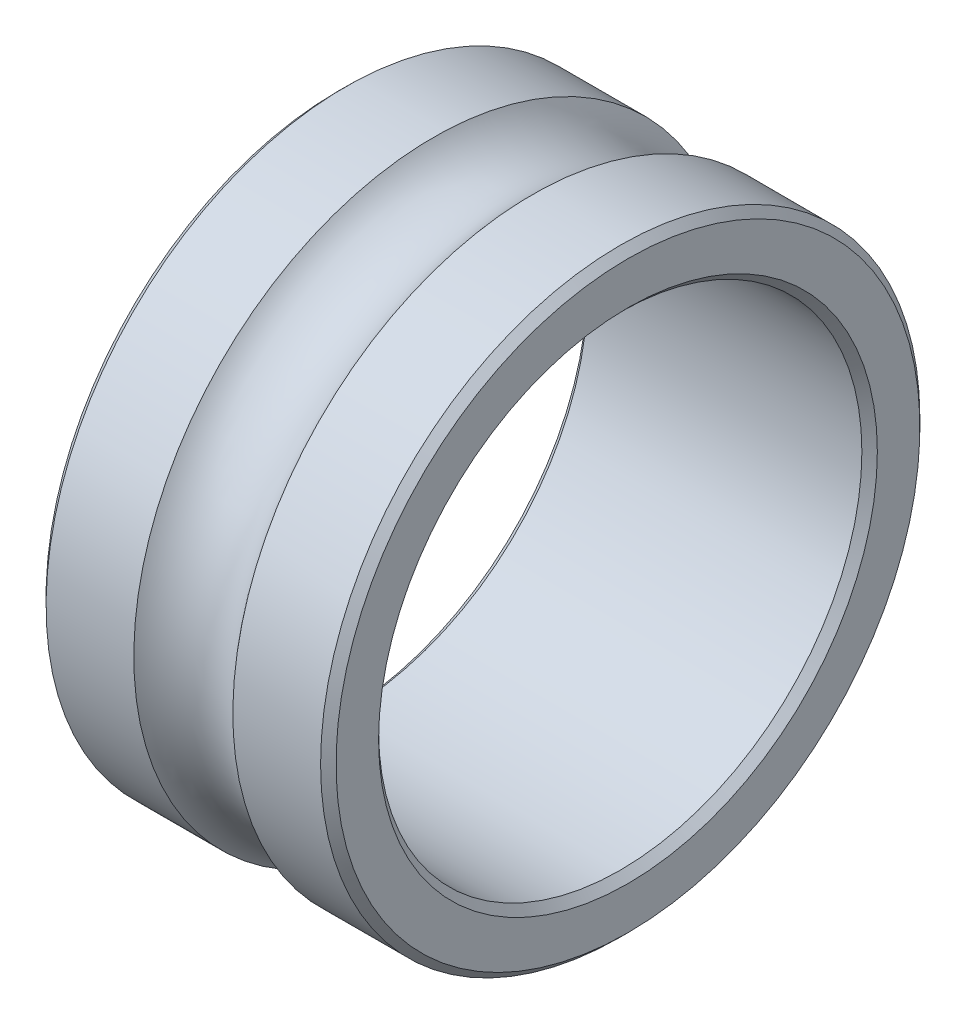
ISO-10303-21;
HEADER;
FILE_DESCRIPTION(('STEP AP214'),'2;1');
FILE_NAME('part.step','',(''),(''),'','','');
FILE_SCHEMA(('AUTOMOTIVE_DESIGN { 1 0 10303 214 1 1 1 1 }'));
ENDSEC;
DATA;
#1=APPLICATION_CONTEXT('core data for automotive mechanical design processes');
#2=APPLICATION_PROTOCOL_DEFINITION('international standard','automotive_design',2000,#1);
#3=PRODUCT_CONTEXT('',#1,'mechanical');
#4=PRODUCT('Part','Part','',(#3));
#5=PRODUCT_RELATED_PRODUCT_CATEGORY('part','',(#4));
#6=PRODUCT_DEFINITION_FORMATION('','',#4);
#7=PRODUCT_DEFINITION_CONTEXT('part definition',#1,'design');
#8=PRODUCT_DEFINITION('design','',#6,#7);
#9=PRODUCT_DEFINITION_SHAPE('','',#8);
#10=(LENGTH_UNIT() NAMED_UNIT(*) SI_UNIT(.MILLI.,.METRE.));
#11=(NAMED_UNIT(*) PLANE_ANGLE_UNIT() SI_UNIT($,.RADIAN.));
#12=(NAMED_UNIT(*) SI_UNIT($,.STERADIAN.) SOLID_ANGLE_UNIT());
#13=UNCERTAINTY_MEASURE_WITH_UNIT(LENGTH_MEASURE(1.E-05),#10,'distance_accuracy_value','');
#14=(GEOMETRIC_REPRESENTATION_CONTEXT(3) GLOBAL_UNCERTAINTY_ASSIGNED_CONTEXT((#13)) GLOBAL_UNIT_ASSIGNED_CONTEXT((#10,
#11,#12)) REPRESENTATION_CONTEXT('',''));
#15=CARTESIAN_POINT('',(0.,0.,0.));
#16=DIRECTION('',(0.,0.,1.));
#17=DIRECTION('',(1.,0.,0.));
#18=AXIS2_PLACEMENT_3D('',#15,#16,#17);
#19=CARTESIAN_POINT('',(0.,0.,0.));
#20=DIRECTION('',(-1.,0.,0.));
#21=DIRECTION('',(0.,-1.,0.));
#22=AXIS2_PLACEMENT_3D('',#19,#20,#21);
#23=TOROIDAL_SURFACE('',#22,3.5,0.65);
#24=CARTESIAN_POINT('',(0.512347538297979,0.,0.));
#25=DIRECTION('',(-1.,0.,0.));
#26=DIRECTION('',(0.,-1.,0.));
#27=AXIS2_PLACEMENT_3D('',#24,#25,#26);
#28=CIRCLE('',#27,3.1);
#29=CARTESIAN_POINT('',(0.512347538297979,-3.1,0.));
#30=VERTEX_POINT('',#29);
#31=EDGE_CURVE('E72',#30,#30,#28,.T.);
#32=ORIENTED_EDGE('',*,*,#31,.T.);
#33=EDGE_LOOP('',(#32));
#34=FACE_BOUND('',#33,.T.);
#35=CARTESIAN_POINT('',(-0.512347538297981,0.,0.));
#36=DIRECTION('',(-1.,0.,0.));
#37=DIRECTION('',(0.,-1.,0.));
#38=AXIS2_PLACEMENT_3D('',#35,#36,#37);
#39=CIRCLE('',#38,3.1);
#40=CARTESIAN_POINT('',(-0.51234753829798,-3.1,0.));
#41=VERTEX_POINT('',#40);
#42=EDGE_CURVE('E69',#41,#41,#39,.T.);
#43=ORIENTED_EDGE('',*,*,#42,.F.);
#44=EDGE_LOOP('',(#43));
#45=FACE_BOUND('',#44,.T.);
#46=ADVANCED_FACE('F37',(#34,#45),#23,.F.);
#47=CARTESIAN_POINT('',(-6.42901749222422,0.,0.));
#48=DIRECTION('',(-1.,0.,0.));
#49=DIRECTION('',(0.,-1.,0.));
#50=AXIS2_PLACEMENT_3D('',#47,#48,#49);
#51=CYLINDRICAL_SURFACE('',#50,3.1);
#52=CARTESIAN_POINT('',(-1.42,0.,0.));
#53=DIRECTION('',(-1.,0.,0.));
#54=DIRECTION('',(0.,-1.,0.));
#55=AXIS2_PLACEMENT_3D('',#52,#53,#54);
#56=CIRCLE('',#55,3.1);
#57=CARTESIAN_POINT('',(-1.42,-3.1,0.));
#58=VERTEX_POINT('',#57);
#59=EDGE_CURVE('E10',#58,#58,#56,.F.);
#60=ORIENTED_EDGE('',*,*,#59,.T.);
#61=EDGE_LOOP('',(#60));
#62=FACE_BOUND('',#61,.T.);
#63=ORIENTED_EDGE('',*,*,#42,.T.);
#64=EDGE_LOOP('',(#63));
#65=FACE_BOUND('',#64,.T.);
#66=ADVANCED_FACE('F95',(#62,#65),#51,.T.);
#67=CARTESIAN_POINT('',(-1.5,-2.5,0.));
#68=DIRECTION('',(-1.,0.,0.));
#69=DIRECTION('',(0.,-1.,0.));
#70=AXIS2_PLACEMENT_3D('',#67,#68,#69);
#71=PLANE('',#70);
#72=CARTESIAN_POINT('',(-1.5,0.,0.));
#73=DIRECTION('',(-1.,0.,0.));
#74=DIRECTION('',(0.,-1.,0.));
#75=AXIS2_PLACEMENT_3D('',#72,#73,#74);
#76=CIRCLE('',#75,2.58);
#77=CARTESIAN_POINT('',(-1.5,-2.58,0.));
#78=VERTEX_POINT('',#77);
#79=EDGE_CURVE('E44',#78,#78,#76,.F.);
#80=ORIENTED_EDGE('',*,*,#79,.T.);
#81=EDGE_LOOP('',(#80));
#82=FACE_BOUND('',#81,.T.);
#83=CARTESIAN_POINT('',(-1.5,0.,0.));
#84=DIRECTION('',(-1.,0.,0.));
#85=DIRECTION('',(0.,-1.,0.));
#86=AXIS2_PLACEMENT_3D('',#83,#84,#85);
#87=CIRCLE('',#86,3.02);
#88=CARTESIAN_POINT('',(-1.5,-3.02,0.));
#89=VERTEX_POINT('',#88);
#90=EDGE_CURVE('E48',#89,#89,#87,.T.);
#91=ORIENTED_EDGE('',*,*,#90,.T.);
#92=EDGE_LOOP('',(#91));
#93=FACE_BOUND('',#92,.T.);
#94=ADVANCED_FACE('F100',(#82,#93),#71,.T.);
#95=CARTESIAN_POINT('',(-6.42901749222422,0.,0.));
#96=DIRECTION('',(-1.,0.,0.));
#97=DIRECTION('',(0.,-1.,0.));
#98=AXIS2_PLACEMENT_3D('',#95,#96,#97);
#99=CYLINDRICAL_SURFACE('',#98,2.5);
#100=CARTESIAN_POINT('',(1.42,0.,0.));
#101=DIRECTION('',(1.,0.,0.));
#102=DIRECTION('',(0.,1.,0.));
#103=AXIS2_PLACEMENT_3D('',#100,#101,#102);
#104=CIRCLE('',#103,2.5);
#105=CARTESIAN_POINT('',(1.42,2.5,0.));
#106=VERTEX_POINT('',#105);
#107=EDGE_CURVE('E52',#106,#106,#104,.T.);
#108=ORIENTED_EDGE('',*,*,#107,.T.);
#109=EDGE_LOOP('',(#108));
#110=FACE_BOUND('',#109,.T.);
#111=CARTESIAN_POINT('',(-1.42,0.,0.));
#112=DIRECTION('',(-1.,0.,0.));
#113=DIRECTION('',(0.,-1.,0.));
#114=AXIS2_PLACEMENT_3D('',#111,#112,#113);
#115=CIRCLE('',#114,2.5);
#116=CARTESIAN_POINT('',(-1.42,-2.5,0.));
#117=VERTEX_POINT('',#116);
#118=EDGE_CURVE('E57',#117,#117,#115,.T.);
#119=ORIENTED_EDGE('',*,*,#118,.T.);
#120=EDGE_LOOP('',(#119));
#121=FACE_BOUND('',#120,.T.);
#122=ADVANCED_FACE('F91',(#110,#121),#99,.F.);
#123=CARTESIAN_POINT('',(1.5,-2.5,0.));
#124=DIRECTION('',(1.,0.,0.));
#125=DIRECTION('',(0.,1.,0.));
#126=AXIS2_PLACEMENT_3D('',#123,#124,#125);
#127=PLANE('',#126);
#128=CARTESIAN_POINT('',(1.5,0.,0.));
#129=DIRECTION('',(1.,0.,0.));
#130=DIRECTION('',(0.,1.,0.));
#131=AXIS2_PLACEMENT_3D('',#128,#129,#130);
#132=CIRCLE('',#131,3.02);
#133=CARTESIAN_POINT('',(1.5,3.02,0.));
#134=VERTEX_POINT('',#133);
#135=EDGE_CURVE('E60',#134,#134,#132,.T.);
#136=ORIENTED_EDGE('',*,*,#135,.T.);
#137=EDGE_LOOP('',(#136));
#138=FACE_BOUND('',#137,.T.);
#139=CARTESIAN_POINT('',(1.5,0.,0.));
#140=DIRECTION('',(1.,0.,0.));
#141=DIRECTION('',(0.,1.,0.));
#142=AXIS2_PLACEMENT_3D('',#139,#140,#141);
#143=CIRCLE('',#142,2.58);
#144=CARTESIAN_POINT('',(1.5,2.58,0.));
#145=VERTEX_POINT('',#144);
#146=EDGE_CURVE('E63',#145,#145,#143,.F.);
#147=ORIENTED_EDGE('',*,*,#146,.T.);
#148=EDGE_LOOP('',(#147));
#149=FACE_BOUND('',#148,.T.);
#150=ADVANCED_FACE('F81',(#138,#149),#127,.T.);
#151=CARTESIAN_POINT('',(-6.42901749222422,0.,0.));
#152=DIRECTION('',(-1.,0.,0.));
#153=DIRECTION('',(0.,-1.,0.));
#154=AXIS2_PLACEMENT_3D('',#151,#152,#153);
#155=CYLINDRICAL_SURFACE('',#154,3.1);
#156=CARTESIAN_POINT('',(1.42,0.,0.));
#157=DIRECTION('',(1.,0.,0.));
#158=DIRECTION('',(0.,1.,0.));
#159=AXIS2_PLACEMENT_3D('',#156,#157,#158);
#160=CIRCLE('',#159,3.1);
#161=CARTESIAN_POINT('',(1.42,3.1,0.));
#162=VERTEX_POINT('',#161);
#163=EDGE_CURVE('E66',#162,#162,#160,.F.);
#164=ORIENTED_EDGE('',*,*,#163,.T.);
#165=EDGE_LOOP('',(#164));
#166=FACE_BOUND('',#165,.T.);
#167=ORIENTED_EDGE('',*,*,#31,.F.);
#168=EDGE_LOOP('',(#167));
#169=FACE_BOUND('',#168,.T.);
#170=ADVANCED_FACE('F78',(#166,#169),#155,.T.);
#171=CARTESIAN_POINT('',(1.42,0.,0.));
#172=DIRECTION('',(-1.,0.,0.));
#173=DIRECTION('',(0.,-1.,0.));
#174=AXIS2_PLACEMENT_3D('',#171,#172,#173);
#175=CONICAL_SURFACE('',#174,3.1,0.785398163397456);
#176=ORIENTED_EDGE('',*,*,#135,.F.);
#177=EDGE_LOOP('',(#176));
#178=FACE_BOUND('',#177,.T.);
#179=ORIENTED_EDGE('',*,*,#163,.F.);
#180=EDGE_LOOP('',(#179));
#181=FACE_BOUND('',#180,.T.);
#182=ADVANCED_FACE('F80',(#178,#181),#175,.T.);
#183=CARTESIAN_POINT('',(1.5,0.,0.));
#184=DIRECTION('',(1.,0.,0.));
#185=DIRECTION('',(0.,1.,0.));
#186=AXIS2_PLACEMENT_3D('',#183,#184,#185);
#187=CONICAL_SURFACE('',#186,2.58,0.785398163397448);
#188=ORIENTED_EDGE('',*,*,#107,.F.);
#189=EDGE_LOOP('',(#188));
#190=FACE_BOUND('',#189,.T.);
#191=ORIENTED_EDGE('',*,*,#146,.F.);
#192=EDGE_LOOP('',(#191));
#193=FACE_BOUND('',#192,.T.);
#194=ADVANCED_FACE('F88',(#190,#193),#187,.F.);
#195=CARTESIAN_POINT('',(-1.42,0.,0.));
#196=DIRECTION('',(-1.,0.,0.));
#197=DIRECTION('',(0.,-1.,0.));
#198=AXIS2_PLACEMENT_3D('',#195,#196,#197);
#199=CONICAL_SURFACE('',#198,2.5,0.785398163397454);
#200=CARTESIAN_POINT('',(-1.5,-2.58,0.));
#201=CARTESIAN_POINT('',(-1.49916666666667,-2.57916666666666,0.));
#202=CARTESIAN_POINT('',(-1.49833333333333,-2.57833333333333,0.));
#203=CARTESIAN_POINT('',(-1.49666666666667,-2.57666666666666,0.));
#204=CARTESIAN_POINT('',(-1.49583333333333,-2.57583333333333,0.));
#205=CARTESIAN_POINT('',(-1.49416666666667,-2.57416666666666,0.));
#206=CARTESIAN_POINT('',(-1.49333333333333,-2.57333333333333,0.));
#207=CARTESIAN_POINT('',(-1.49166666666667,-2.57166666666667,0.));
#208=CARTESIAN_POINT('',(-1.49083333333333,-2.57083333333333,0.));
#209=CARTESIAN_POINT('',(-1.48916666666667,-2.56916666666667,0.));
#210=CARTESIAN_POINT('',(-1.48833333333333,-2.56833333333333,0.));
#211=CARTESIAN_POINT('',(-1.48666666666667,-2.56666666666667,0.));
#212=CARTESIAN_POINT('',(-1.48583333333333,-2.56583333333333,0.));
#213=CARTESIAN_POINT('',(-1.48416666666667,-2.56416666666667,0.));
#214=CARTESIAN_POINT('',(-1.48333333333333,-2.56333333333333,0.));
#215=CARTESIAN_POINT('',(-1.48166666666667,-2.56166666666667,0.));
#216=CARTESIAN_POINT('',(-1.48083333333333,-2.56083333333333,0.));
#217=CARTESIAN_POINT('',(-1.47916666666667,-2.55916666666667,0.));
#218=CARTESIAN_POINT('',(-1.47833333333333,-2.55833333333333,0.));
#219=CARTESIAN_POINT('',(-1.47666666666667,-2.55666666666667,0.));
#220=CARTESIAN_POINT('',(-1.47583333333333,-2.55583333333333,0.));
#221=CARTESIAN_POINT('',(-1.47416666666667,-2.55416666666667,0.));
#222=CARTESIAN_POINT('',(-1.47333333333333,-2.55333333333333,0.));
#223=CARTESIAN_POINT('',(-1.47166666666667,-2.55166666666667,0.));
#224=CARTESIAN_POINT('',(-1.47083333333333,-2.55083333333333,0.));
#225=CARTESIAN_POINT('',(-1.46916666666667,-2.54916666666667,0.));
#226=CARTESIAN_POINT('',(-1.46833333333333,-2.54833333333333,0.));
#227=CARTESIAN_POINT('',(-1.46666666666667,-2.54666666666667,0.));
#228=CARTESIAN_POINT('',(-1.46583333333333,-2.54583333333333,0.));
#229=CARTESIAN_POINT('',(-1.46416666666667,-2.54416666666667,0.));
#230=CARTESIAN_POINT('',(-1.46333333333333,-2.54333333333333,0.));
#231=CARTESIAN_POINT('',(-1.46166666666667,-2.54166666666667,0.));
#232=CARTESIAN_POINT('',(-1.46083333333333,-2.54083333333333,0.));
#233=CARTESIAN_POINT('',(-1.45916666666667,-2.53916666666667,0.));
#234=CARTESIAN_POINT('',(-1.45833333333333,-2.53833333333333,0.));
#235=CARTESIAN_POINT('',(-1.45666666666667,-2.53666666666667,0.));
#236=CARTESIAN_POINT('',(-1.45583333333334,-2.53583333333333,0.));
#237=CARTESIAN_POINT('',(-1.45416666666667,-2.53416666666667,0.));
#238=CARTESIAN_POINT('',(-1.45333333333334,-2.53333333333333,0.));
#239=CARTESIAN_POINT('',(-1.45166666666667,-2.53166666666667,0.));
#240=CARTESIAN_POINT('',(-1.45083333333334,-2.53083333333333,0.));
#241=CARTESIAN_POINT('',(-1.44916666666667,-2.52916666666667,0.));
#242=CARTESIAN_POINT('',(-1.44833333333334,-2.52833333333333,0.));
#243=CARTESIAN_POINT('',(-1.44666666666667,-2.52666666666667,0.));
#244=CARTESIAN_POINT('',(-1.44583333333334,-2.52583333333333,0.));
#245=CARTESIAN_POINT('',(-1.44416666666667,-2.52416666666667,0.));
#246=CARTESIAN_POINT('',(-1.44333333333334,-2.52333333333333,0.));
#247=CARTESIAN_POINT('',(-1.44166666666667,-2.52166666666667,0.));
#248=CARTESIAN_POINT('',(-1.44083333333334,-2.52083333333333,0.));
#249=CARTESIAN_POINT('',(-1.43916666666667,-2.51916666666667,0.));
#250=CARTESIAN_POINT('',(-1.43833333333334,-2.51833333333333,0.));
#251=CARTESIAN_POINT('',(-1.43666666666667,-2.51666666666667,0.));
#252=CARTESIAN_POINT('',(-1.43583333333334,-2.51583333333333,0.));
#253=CARTESIAN_POINT('',(-1.43416666666667,-2.51416666666667,0.));
#254=CARTESIAN_POINT('',(-1.43333333333334,-2.51333333333333,0.));
#255=CARTESIAN_POINT('',(-1.43166666666667,-2.51166666666667,0.));
#256=CARTESIAN_POINT('',(-1.43083333333334,-2.51083333333333,0.));
#257=CARTESIAN_POINT('',(-1.42916666666667,-2.50916666666667,0.));
#258=CARTESIAN_POINT('',(-1.42833333333334,-2.50833333333333,0.));
#259=CARTESIAN_POINT('',(-1.42666666666667,-2.50666666666667,0.));
#260=CARTESIAN_POINT('',(-1.42583333333334,-2.50583333333333,0.));
#261=CARTESIAN_POINT('',(-1.42416666666667,-2.50416666666667,0.));
#262=CARTESIAN_POINT('',(-1.42333333333334,-2.50333333333333,0.));
#263=CARTESIAN_POINT('',(-1.42166666666667,-2.50166666666667,0.));
#264=CARTESIAN_POINT('',(-1.42083333333334,-2.50083333333333,0.));
#265=CARTESIAN_POINT('',(-1.42,-2.5,0.));
#266=B_SPLINE_CURVE_WITH_KNOTS('',3,(#200,#201,#202,#203,#204,#205,#206,#207,#208,#209,#210,
#211,#212,#213,#214,#215,#216,#217,#218,#219,#220,#221,#222,#223,#224,#225,#226,#227,#228,#229,
#230,#231,#232,#233,#234,#235,#236,#237,#238,#239,#240,#241,#242,#243,#244,#245,#246,#247,#248,
#249,#250,#251,#252,#253,#254,#255,#256,#257,#258,#259,#260,#261,#262,#263,#264,#265),
.UNSPECIFIED.,.F.,.F.,(4,2,2,2,2,2,2,2,2,2,2,2,2,2,2,2,2,2,2,2,2,2,2,2,2,2,2,2,2,2,2,2,4),(0.,
0.00353553390593244,0.00707106781186503,0.0106066017177976,0.0141421356237302,
0.0176776695296628,0.0212132034355954,0.024748737341528,0.0282842712474606,0.0318198051533935,
0.0353553390593261,0.0388908729652587,0.0424264068711913,0.0459619407771239,0.0494974746830565,
0.0530330085889891,0.0565685424949217,0.0601040764008541,0.0636396103067867,0.0671751442127193,
0.0707106781186519,0.0742462120245845,0.0777817459305171,0.0813172798364497,0.0848528137423822,
0.0883883476483148,0.0919238815542474,0.09545941546018,0.0989949493661126,0.102530483272045,
0.106066017177978,0.10960155108391,0.113137084989843),.UNSPECIFIED.);
#267=EDGE_CURVE('BSEAM105',#78,#117,#266,.T.);
#268=ORIENTED_EDGE('',*,*,#79,.F.);
#269=ORIENTED_EDGE('',*,*,#118,.F.);
#270=ORIENTED_EDGE('',*,*,#267,.T.);
#271=ORIENTED_EDGE('',*,*,#267,.F.);
#272=EDGE_LOOP('',(#268,#270,#269,#271));
#273=FACE_BOUND('',#272,.T.);
#274=ADVANCED_FACE('F105',(#273),#199,.F.);
#275=CARTESIAN_POINT('',(-1.5,0.,0.));
#276=DIRECTION('',(1.,0.,0.));
#277=DIRECTION('',(0.,1.,0.));
#278=AXIS2_PLACEMENT_3D('',#275,#276,#277);
#279=CONICAL_SURFACE('',#278,3.02,0.785398163397451);
#280=ORIENTED_EDGE('',*,*,#59,.F.);
#281=EDGE_LOOP('',(#280));
#282=FACE_BOUND('',#281,.T.);
#283=ORIENTED_EDGE('',*,*,#90,.F.);
#284=EDGE_LOOP('',(#283));
#285=FACE_BOUND('',#284,.T.);
#286=ADVANCED_FACE('F39',(#282,#285),#279,.T.);
#287=CLOSED_SHELL('',(#46,#66,#94,#122,#150,#170,#182,#194,#274,#286));
#288=MANIFOLD_SOLID_BREP('B2',#287);
#289=ADVANCED_BREP_SHAPE_REPRESENTATION('',(#18,#288),#14);
#290=SHAPE_DEFINITION_REPRESENTATION(#9,#289);
ENDSEC;
END-ISO-10303-21;
